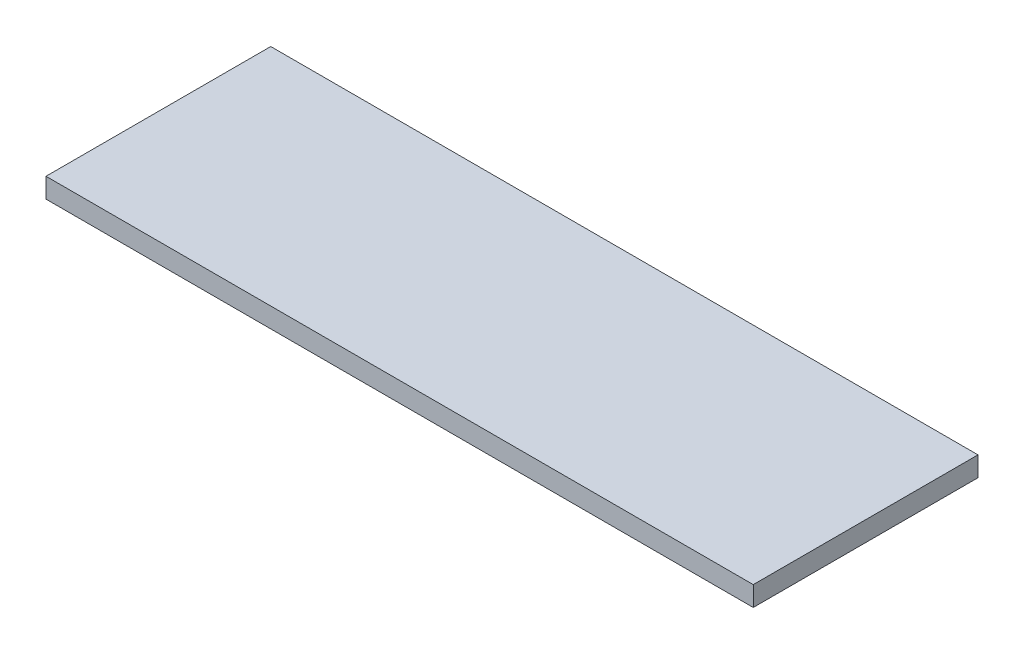
ISO-10303-21;
HEADER;
FILE_DESCRIPTION(('STEP AP214'),'2;1');
FILE_NAME('part.step','',(''),(''),'','','');
FILE_SCHEMA(('AUTOMOTIVE_DESIGN { 1 0 10303 214 1 1 1 1 }'));
ENDSEC;
DATA;
#1=APPLICATION_CONTEXT('core data for automotive mechanical design processes');
#2=APPLICATION_PROTOCOL_DEFINITION('international standard','automotive_design',2000,#1);
#3=PRODUCT_CONTEXT('',#1,'mechanical');
#4=PRODUCT('Part','Part','',(#3));
#5=PRODUCT_RELATED_PRODUCT_CATEGORY('part','',(#4));
#6=PRODUCT_DEFINITION_FORMATION('','',#4);
#7=PRODUCT_DEFINITION_CONTEXT('part definition',#1,'design');
#8=PRODUCT_DEFINITION('design','',#6,#7);
#9=PRODUCT_DEFINITION_SHAPE('','',#8);
#10=(LENGTH_UNIT() NAMED_UNIT(*) SI_UNIT(.MILLI.,.METRE.));
#11=(NAMED_UNIT(*) PLANE_ANGLE_UNIT() SI_UNIT($,.RADIAN.));
#12=(NAMED_UNIT(*) SI_UNIT($,.STERADIAN.) SOLID_ANGLE_UNIT());
#13=UNCERTAINTY_MEASURE_WITH_UNIT(LENGTH_MEASURE(1.E-05),#10,'distance_accuracy_value','');
#14=(GEOMETRIC_REPRESENTATION_CONTEXT(3) GLOBAL_UNCERTAINTY_ASSIGNED_CONTEXT((#13)) GLOBAL_UNIT_ASSIGNED_CONTEXT((#10,
#11,#12)) REPRESENTATION_CONTEXT('',''));
#15=CARTESIAN_POINT('',(0.,0.,0.));
#16=DIRECTION('',(0.,0.,1.));
#17=DIRECTION('',(1.,0.,0.));
#18=AXIS2_PLACEMENT_3D('',#15,#16,#17);
#19=CARTESIAN_POINT('',(0.,3.,0.));
#20=DIRECTION('',(1.,0.,0.));
#21=DIRECTION('',(0.,0.,-1.));
#22=AXIS2_PLACEMENT_3D('',#19,#20,#21);
#23=PLANE('',#22);
#24=DIRECTION('',(0.,0.,1.));
#25=VECTOR('',#24,1.);
#26=CARTESIAN_POINT('',(0.,0.,0.));
#27=LINE('',#26,#25);
#28=CARTESIAN_POINT('',(0.,0.,-34.));
#29=VERTEX_POINT('',#28);
#30=CARTESIAN_POINT('',(0.,0.,0.));
#31=VERTEX_POINT('',#30);
#32=EDGE_CURVE('E102',#29,#31,#27,.T.);
#33=ORIENTED_EDGE('',*,*,#32,.T.);
#34=DIRECTION('',(0.,-1.,0.));
#35=VECTOR('',#34,1.);
#36=CARTESIAN_POINT('',(0.,3.,0.));
#37=LINE('',#36,#35);
#38=CARTESIAN_POINT('',(0.,3.,0.));
#39=VERTEX_POINT('',#38);
#40=EDGE_CURVE('E11',#39,#31,#37,.T.);
#41=ORIENTED_EDGE('',*,*,#40,.F.);
#42=DIRECTION('',(0.,0.,1.));
#43=VECTOR('',#42,1.);
#44=CARTESIAN_POINT('',(0.,3.,0.));
#45=LINE('',#44,#43);
#46=CARTESIAN_POINT('',(0.,3.,-34.));
#47=VERTEX_POINT('',#46);
#48=EDGE_CURVE('E90',#47,#39,#45,.T.);
#49=ORIENTED_EDGE('',*,*,#48,.F.);
#50=DIRECTION('',(0.,-1.,0.));
#51=VECTOR('',#50,1.);
#52=CARTESIAN_POINT('',(0.,3.,-34.));
#53=LINE('',#52,#51);
#54=EDGE_CURVE('E98',#47,#29,#53,.T.);
#55=ORIENTED_EDGE('',*,*,#54,.T.);
#56=EDGE_LOOP('',(#33,#41,#49,#55));
#57=FACE_BOUND('',#56,.T.);
#58=ADVANCED_FACE('F39',(#57),#23,.F.);
#59=CARTESIAN_POINT('',(0.,3.,0.));
#60=DIRECTION('',(0.,0.,-1.));
#61=DIRECTION('',(-1.,0.,0.));
#62=AXIS2_PLACEMENT_3D('',#59,#60,#61);
#63=PLANE('',#62);
#64=DIRECTION('',(1.,0.,0.));
#65=VECTOR('',#64,1.);
#66=CARTESIAN_POINT('',(0.,0.,0.));
#67=LINE('',#66,#65);
#68=CARTESIAN_POINT('',(107.,0.,0.));
#69=VERTEX_POINT('',#68);
#70=EDGE_CURVE('E94',#31,#69,#67,.T.);
#71=ORIENTED_EDGE('',*,*,#70,.T.);
#72=DIRECTION('',(0.,-1.,0.));
#73=VECTOR('',#72,1.);
#74=CARTESIAN_POINT('',(107.,3.,0.));
#75=LINE('',#74,#73);
#76=CARTESIAN_POINT('',(107.,3.,0.));
#77=VERTEX_POINT('',#76);
#78=EDGE_CURVE('E47',#77,#69,#75,.T.);
#79=ORIENTED_EDGE('',*,*,#78,.F.);
#80=DIRECTION('',(1.,0.,0.));
#81=VECTOR('',#80,1.);
#82=CARTESIAN_POINT('',(0.,3.,0.));
#83=LINE('',#82,#81);
#84=EDGE_CURVE('E85',#39,#77,#83,.T.);
#85=ORIENTED_EDGE('',*,*,#84,.F.);
#86=ORIENTED_EDGE('',*,*,#40,.T.);
#87=EDGE_LOOP('',(#71,#79,#85,#86));
#88=FACE_BOUND('',#87,.T.);
#89=ADVANCED_FACE('F93',(#88),#63,.F.);
#90=CARTESIAN_POINT('',(107.,3.,0.));
#91=DIRECTION('',(-1.,0.,0.));
#92=DIRECTION('',(0.,0.,1.));
#93=AXIS2_PLACEMENT_3D('',#90,#91,#92);
#94=PLANE('',#93);
#95=DIRECTION('',(0.,0.,-1.));
#96=VECTOR('',#95,1.);
#97=CARTESIAN_POINT('',(107.,0.,0.));
#98=LINE('',#97,#96);
#99=CARTESIAN_POINT('',(107.,0.,-34.));
#100=VERTEX_POINT('',#99);
#101=EDGE_CURVE('E72',#69,#100,#98,.T.);
#102=ORIENTED_EDGE('',*,*,#101,.T.);
#103=DIRECTION('',(0.,-1.,0.));
#104=VECTOR('',#103,1.);
#105=CARTESIAN_POINT('',(107.,3.,-34.));
#106=LINE('',#105,#104);
#107=CARTESIAN_POINT('',(107.,3.,-34.));
#108=VERTEX_POINT('',#107);
#109=EDGE_CURVE('E95',#108,#100,#106,.T.);
#110=ORIENTED_EDGE('',*,*,#109,.F.);
#111=DIRECTION('',(0.,0.,-1.));
#112=VECTOR('',#111,1.);
#113=CARTESIAN_POINT('',(107.,3.,0.));
#114=LINE('',#113,#112);
#115=EDGE_CURVE('E88',#77,#108,#114,.T.);
#116=ORIENTED_EDGE('',*,*,#115,.F.);
#117=ORIENTED_EDGE('',*,*,#78,.T.);
#118=EDGE_LOOP('',(#102,#110,#116,#117));
#119=FACE_BOUND('',#118,.T.);
#120=ADVANCED_FACE('F96',(#119),#94,.F.);
#121=CARTESIAN_POINT('',(0.,3.,-34.));
#122=DIRECTION('',(0.,0.,1.));
#123=DIRECTION('',(1.,0.,0.));
#124=AXIS2_PLACEMENT_3D('',#121,#122,#123);
#125=PLANE('',#124);
#126=DIRECTION('',(-1.,0.,0.));
#127=VECTOR('',#126,1.);
#128=CARTESIAN_POINT('',(0.,0.,-34.));
#129=LINE('',#128,#127);
#130=EDGE_CURVE('E78',#100,#29,#129,.T.);
#131=ORIENTED_EDGE('',*,*,#130,.T.);
#132=ORIENTED_EDGE('',*,*,#54,.F.);
#133=DIRECTION('',(-1.,0.,0.));
#134=VECTOR('',#133,1.);
#135=CARTESIAN_POINT('',(0.,3.,-34.));
#136=LINE('',#135,#134);
#137=EDGE_CURVE('E55',#108,#47,#136,.T.);
#138=ORIENTED_EDGE('',*,*,#137,.F.);
#139=ORIENTED_EDGE('',*,*,#109,.T.);
#140=EDGE_LOOP('',(#131,#132,#138,#139));
#141=FACE_BOUND('',#140,.T.);
#142=ADVANCED_FACE('F109',(#141),#125,.F.);
#143=CARTESIAN_POINT('',(0.,3.,0.));
#144=DIRECTION('',(0.,-1.,0.));
#145=DIRECTION('',(0.,0.,-1.));
#146=AXIS2_PLACEMENT_3D('',#143,#144,#145);
#147=PLANE('',#146);
#148=ORIENTED_EDGE('',*,*,#48,.T.);
#149=ORIENTED_EDGE('',*,*,#84,.T.);
#150=ORIENTED_EDGE('',*,*,#115,.T.);
#151=ORIENTED_EDGE('',*,*,#137,.T.);
#152=EDGE_LOOP('',(#148,#149,#150,#151));
#153=FACE_BOUND('',#152,.T.);
#154=ADVANCED_FACE('F86',(#153),#147,.F.);
#155=CARTESIAN_POINT('',(0.,0.,0.));
#156=DIRECTION('',(0.,-1.,0.));
#157=DIRECTION('',(0.,0.,-1.));
#158=AXIS2_PLACEMENT_3D('',#155,#156,#157);
#159=PLANE('',#158);
#160=ORIENTED_EDGE('',*,*,#32,.F.);
#161=ORIENTED_EDGE('',*,*,#130,.F.);
#162=ORIENTED_EDGE('',*,*,#101,.F.);
#163=ORIENTED_EDGE('',*,*,#70,.F.);
#164=EDGE_LOOP('',(#160,#161,#162,#163));
#165=FACE_BOUND('',#164,.T.);
#166=ADVANCED_FACE('F112',(#165),#159,.T.);
#167=CLOSED_SHELL('',(#58,#89,#120,#142,#154,#166));
#168=MANIFOLD_SOLID_BREP('B2',#167);
#169=ADVANCED_BREP_SHAPE_REPRESENTATION('',(#18,#168),#14);
#170=SHAPE_DEFINITION_REPRESENTATION(#9,#169);
ENDSEC;
END-ISO-10303-21;
